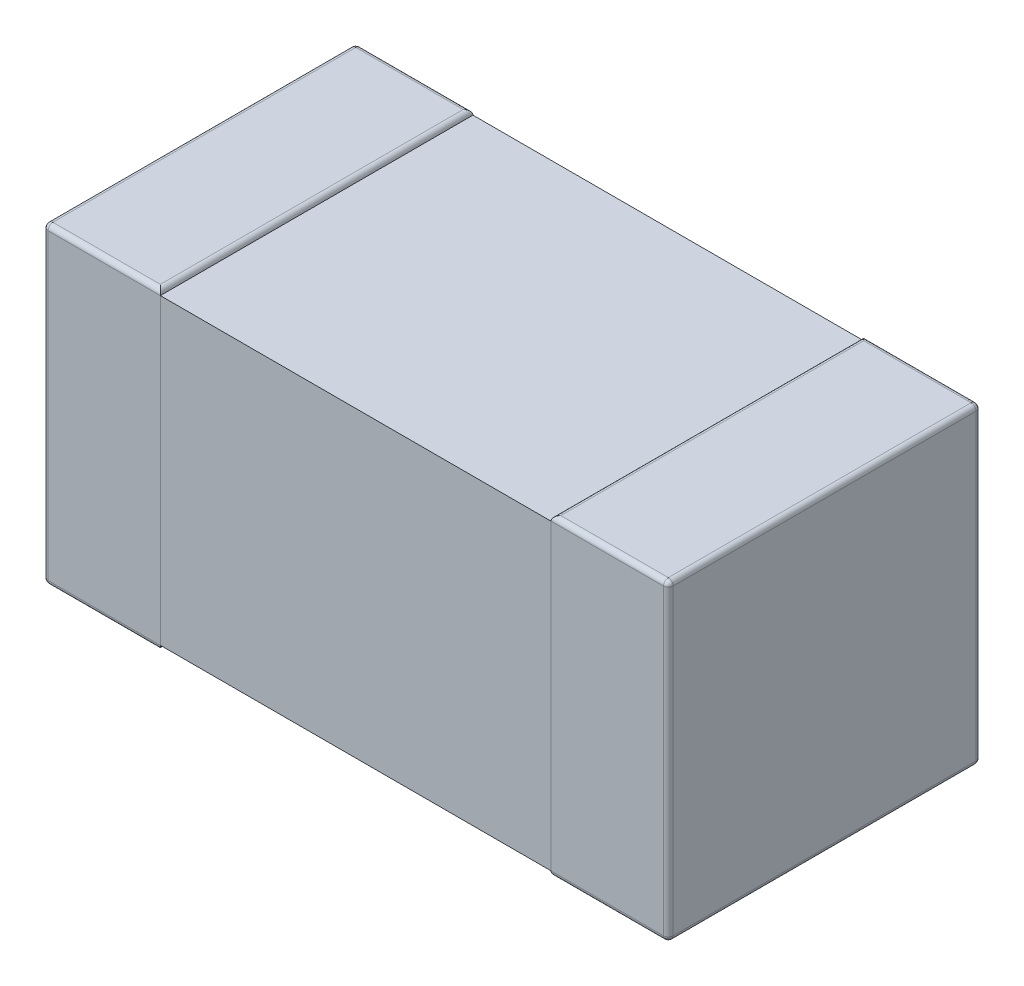
ISO-10303-21;
HEADER;
FILE_DESCRIPTION(('STEP AP214'),'2;1');
FILE_NAME('part.step','',(''),(''),'','','');
FILE_SCHEMA(('AUTOMOTIVE_DESIGN { 1 0 10303 214 1 1 1 1 }'));
ENDSEC;
DATA;
#1=APPLICATION_CONTEXT('core data for automotive mechanical design processes');
#2=APPLICATION_PROTOCOL_DEFINITION('international standard','automotive_design',2000,#1);
#3=PRODUCT_CONTEXT('',#1,'mechanical');
#4=PRODUCT('Part','Part','',(#3));
#5=PRODUCT_RELATED_PRODUCT_CATEGORY('part','',(#4));
#6=PRODUCT_DEFINITION_FORMATION('','',#4);
#7=PRODUCT_DEFINITION_CONTEXT('part definition',#1,'design');
#8=PRODUCT_DEFINITION('design','',#6,#7);
#9=PRODUCT_DEFINITION_SHAPE('','',#8);
#10=(LENGTH_UNIT() NAMED_UNIT(*) SI_UNIT(.MILLI.,.METRE.));
#11=(NAMED_UNIT(*) PLANE_ANGLE_UNIT() SI_UNIT($,.RADIAN.));
#12=(NAMED_UNIT(*) SI_UNIT($,.STERADIAN.) SOLID_ANGLE_UNIT());
#13=UNCERTAINTY_MEASURE_WITH_UNIT(LENGTH_MEASURE(1.E-05),#10,'distance_accuracy_value','');
#14=(GEOMETRIC_REPRESENTATION_CONTEXT(3) GLOBAL_UNCERTAINTY_ASSIGNED_CONTEXT((#13)) GLOBAL_UNIT_ASSIGNED_CONTEXT((#10,
#11,#12)) REPRESENTATION_CONTEXT('',''));
#15=CARTESIAN_POINT('',(0.,0.,0.));
#16=DIRECTION('',(0.,0.,1.));
#17=DIRECTION('',(1.,0.,0.));
#18=AXIS2_PLACEMENT_3D('',#15,#16,#17);
#19=CARTESIAN_POINT('',(-0.8,0.8125,-0.4));
#20=DIRECTION('',(0.,0.,1.));
#21=DIRECTION('',(1.,0.,0.));
#22=AXIS2_PLACEMENT_3D('',#19,#20,#21);
#23=PLANE('',#22);
#24=DIRECTION('',(0.,1.,0.));
#25=VECTOR('',#24,1.);
#26=CARTESIAN_POINT('',(-0.5,0.8125,-0.4));
#27=LINE('',#26,#25);
#28=CARTESIAN_POINT('',(-0.5,0.025,-0.4));
#29=VERTEX_POINT('',#28);
#30=CARTESIAN_POINT('',(-0.5,0.8,-0.4));
#31=VERTEX_POINT('',#30);
#32=EDGE_CURVE('E299',#29,#31,#27,.T.);
#33=ORIENTED_EDGE('',*,*,#32,.F.);
#34=DIRECTION('',(-1.,0.,0.));
#35=VECTOR('',#34,1.);
#36=CARTESIAN_POINT('',(-0.8,0.025,-0.4));
#37=LINE('',#36,#35);
#38=CARTESIAN_POINT('',(-0.7875,0.025,-0.4));
#39=VERTEX_POINT('',#38);
#40=EDGE_CURVE('E11',#29,#39,#37,.T.);
#41=ORIENTED_EDGE('',*,*,#40,.T.);
#42=DIRECTION('',(0.,1.,0.));
#43=VECTOR('',#42,1.);
#44=CARTESIAN_POINT('',(-0.7875,0.8125,-0.4));
#45=LINE('',#44,#43);
#46=CARTESIAN_POINT('',(-0.7875,0.8,-0.4));
#47=VERTEX_POINT('',#46);
#48=EDGE_CURVE('E27',#39,#47,#45,.T.);
#49=ORIENTED_EDGE('',*,*,#48,.T.);
#50=DIRECTION('',(1.,0.,0.));
#51=VECTOR('',#50,1.);
#52=CARTESIAN_POINT('',(-0.8,0.8,-0.4));
#53=LINE('',#52,#51);
#54=EDGE_CURVE('E381',#47,#31,#53,.T.);
#55=ORIENTED_EDGE('',*,*,#54,.T.);
#56=EDGE_LOOP('',(#33,#41,#49,#55));
#57=FACE_BOUND('',#56,.T.);
#58=ADVANCED_FACE('F16',(#57),#23,.F.);
#59=CARTESIAN_POINT('',(-0.8,0.8125,-0.4));
#60=DIRECTION('',(0.,0.,1.));
#61=DIRECTION('',(1.,0.,0.));
#62=AXIS2_PLACEMENT_3D('',#59,#60,#61);
#63=PLANE('',#62);
#64=DIRECTION('',(0.,-1.,0.));
#65=VECTOR('',#64,1.);
#66=CARTESIAN_POINT('',(0.5,0.8125,-0.4));
#67=LINE('',#66,#65);
#68=CARTESIAN_POINT('',(0.5,0.8,-0.4));
#69=VERTEX_POINT('',#68);
#70=CARTESIAN_POINT('',(0.5,0.025,-0.4));
#71=VERTEX_POINT('',#70);
#72=EDGE_CURVE('E300',#69,#71,#67,.T.);
#73=ORIENTED_EDGE('',*,*,#72,.F.);
#74=DIRECTION('',(1.,0.,0.));
#75=VECTOR('',#74,1.);
#76=CARTESIAN_POINT('',(-0.8,0.8,-0.4));
#77=LINE('',#76,#75);
#78=CARTESIAN_POINT('',(0.7875,0.8,-0.4));
#79=VERTEX_POINT('',#78);
#80=EDGE_CURVE('E352',#69,#79,#77,.T.);
#81=ORIENTED_EDGE('',*,*,#80,.T.);
#82=DIRECTION('',(0.,-1.,0.));
#83=VECTOR('',#82,1.);
#84=CARTESIAN_POINT('',(0.7875,0.8125,-0.4));
#85=LINE('',#84,#83);
#86=CARTESIAN_POINT('',(0.7875,0.025,-0.4));
#87=VERTEX_POINT('',#86);
#88=EDGE_CURVE('E345',#79,#87,#85,.T.);
#89=ORIENTED_EDGE('',*,*,#88,.T.);
#90=DIRECTION('',(-1.,0.,0.));
#91=VECTOR('',#90,1.);
#92=CARTESIAN_POINT('',(0.5,0.025,-0.4));
#93=LINE('',#92,#91);
#94=EDGE_CURVE('E353',#87,#71,#93,.T.);
#95=ORIENTED_EDGE('',*,*,#94,.T.);
#96=EDGE_LOOP('',(#73,#81,#89,#95));
#97=FACE_BOUND('',#96,.T.);
#98=ADVANCED_FACE('F906',(#97),#63,.F.);
#99=CARTESIAN_POINT('',(-0.8,0.8125,0.4));
#100=DIRECTION('',(0.,0.,-1.));
#101=DIRECTION('',(0.,-1.,0.));
#102=AXIS2_PLACEMENT_3D('',#99,#100,#101);
#103=PLANE('',#102);
#104=DIRECTION('',(0.,-1.,0.));
#105=VECTOR('',#104,1.);
#106=CARTESIAN_POINT('',(-0.7875,0.8125,0.4));
#107=LINE('',#106,#105);
#108=CARTESIAN_POINT('',(-0.7875,0.8,0.4));
#109=VERTEX_POINT('',#108);
#110=CARTESIAN_POINT('',(-0.7875,0.025,0.4));
#111=VERTEX_POINT('',#110);
#112=EDGE_CURVE('E447',#109,#111,#107,.T.);
#113=ORIENTED_EDGE('',*,*,#112,.T.);
#114=DIRECTION('',(1.,0.,0.));
#115=VECTOR('',#114,1.);
#116=CARTESIAN_POINT('',(-0.5,0.025,0.4));
#117=LINE('',#116,#115);
#118=CARTESIAN_POINT('',(-0.5,0.025,0.4));
#119=VERTEX_POINT('',#118);
#120=EDGE_CURVE('E377',#111,#119,#117,.T.);
#121=ORIENTED_EDGE('',*,*,#120,.T.);
#122=DIRECTION('',(0.,-1.,0.));
#123=VECTOR('',#122,1.);
#124=CARTESIAN_POINT('',(-0.5,0.8125,0.4));
#125=LINE('',#124,#123);
#126=CARTESIAN_POINT('',(-0.5,0.8,0.4));
#127=VERTEX_POINT('',#126);
#128=EDGE_CURVE('E246',#127,#119,#125,.T.);
#129=ORIENTED_EDGE('',*,*,#128,.F.);
#130=DIRECTION('',(-1.,0.,0.));
#131=VECTOR('',#130,1.);
#132=CARTESIAN_POINT('',(-0.8,0.8,0.4));
#133=LINE('',#132,#131);
#134=EDGE_CURVE('E373',#127,#109,#133,.T.);
#135=ORIENTED_EDGE('',*,*,#134,.T.);
#136=EDGE_LOOP('',(#113,#121,#129,#135));
#137=FACE_BOUND('',#136,.T.);
#138=ADVANCED_FACE('F1104',(#137),#103,.F.);
#139=CARTESIAN_POINT('',(-0.8,0.8125,0.4));
#140=DIRECTION('',(0.,0.,-1.));
#141=DIRECTION('',(0.,-1.,0.));
#142=AXIS2_PLACEMENT_3D('',#139,#140,#141);
#143=PLANE('',#142);
#144=DIRECTION('',(0.,1.,0.));
#145=VECTOR('',#144,1.);
#146=CARTESIAN_POINT('',(0.7875,0.8125,0.4));
#147=LINE('',#146,#145);
#148=CARTESIAN_POINT('',(0.7875,0.025,0.4));
#149=VERTEX_POINT('',#148);
#150=CARTESIAN_POINT('',(0.7875,0.8,0.4));
#151=VERTEX_POINT('',#150);
#152=EDGE_CURVE('E305',#149,#151,#147,.T.);
#153=ORIENTED_EDGE('',*,*,#152,.T.);
#154=DIRECTION('',(-1.,0.,0.));
#155=VECTOR('',#154,1.);
#156=CARTESIAN_POINT('',(-0.8,0.8,0.4));
#157=LINE('',#156,#155);
#158=CARTESIAN_POINT('',(0.5,0.8,0.4));
#159=VERTEX_POINT('',#158);
#160=EDGE_CURVE('E301',#151,#159,#157,.T.);
#161=ORIENTED_EDGE('',*,*,#160,.T.);
#162=DIRECTION('',(0.,1.,0.));
#163=VECTOR('',#162,1.);
#164=CARTESIAN_POINT('',(0.5,0.8125,0.4));
#165=LINE('',#164,#163);
#166=CARTESIAN_POINT('',(0.5,0.025,0.4));
#167=VERTEX_POINT('',#166);
#168=EDGE_CURVE('E253',#167,#159,#165,.T.);
#169=ORIENTED_EDGE('',*,*,#168,.F.);
#170=DIRECTION('',(1.,0.,0.));
#171=VECTOR('',#170,1.);
#172=CARTESIAN_POINT('',(0.8,0.025,0.4));
#173=LINE('',#172,#171);
#174=EDGE_CURVE('E306',#167,#149,#173,.T.);
#175=ORIENTED_EDGE('',*,*,#174,.T.);
#176=EDGE_LOOP('',(#153,#161,#169,#175));
#177=FACE_BOUND('',#176,.T.);
#178=ADVANCED_FACE('F931',(#177),#143,.F.);
#179=CARTESIAN_POINT('',(0.,0.8125,0.));
#180=DIRECTION('',(0.,-1.,0.));
#181=DIRECTION('',(0.,0.,-1.));
#182=AXIS2_PLACEMENT_3D('',#179,#180,#181);
#183=PLANE('',#182);
#184=DIRECTION('',(-1.,0.,0.));
#185=VECTOR('',#184,1.);
#186=CARTESIAN_POINT('',(0.,0.8125,-0.3875));
#187=LINE('',#186,#185);
#188=CARTESIAN_POINT('',(-0.5125,0.8125,-0.3875));
#189=VERTEX_POINT('',#188);
#190=CARTESIAN_POINT('',(-0.7875,0.8125,-0.3875));
#191=VERTEX_POINT('',#190);
#192=EDGE_CURVE('E259',#189,#191,#187,.T.);
#193=ORIENTED_EDGE('',*,*,#192,.T.);
#194=DIRECTION('',(0.,0.,1.));
#195=VECTOR('',#194,1.);
#196=CARTESIAN_POINT('',(-0.7875,0.8125,0.));
#197=LINE('',#196,#195);
#198=CARTESIAN_POINT('',(-0.7875,0.8125,0.3875));
#199=VERTEX_POINT('',#198);
#200=EDGE_CURVE('E255',#191,#199,#197,.T.);
#201=ORIENTED_EDGE('',*,*,#200,.T.);
#202=DIRECTION('',(1.,0.,0.));
#203=VECTOR('',#202,1.);
#204=CARTESIAN_POINT('',(0.,0.8125,0.3875));
#205=LINE('',#204,#203);
#206=CARTESIAN_POINT('',(-0.5125,0.8125,0.3875));
#207=VERTEX_POINT('',#206);
#208=EDGE_CURVE('E260',#199,#207,#205,.T.);
#209=ORIENTED_EDGE('',*,*,#208,.T.);
#210=DIRECTION('',(0.,0.,-1.));
#211=VECTOR('',#210,1.);
#212=CARTESIAN_POINT('',(-0.5125,0.8125,0.));
#213=LINE('',#212,#211);
#214=EDGE_CURVE('E401',#207,#189,#213,.T.);
#215=ORIENTED_EDGE('',*,*,#214,.T.);
#216=EDGE_LOOP('',(#193,#201,#209,#215));
#217=FACE_BOUND('',#216,.T.);
#218=ADVANCED_FACE('F927',(#217),#183,.F.);
#219=CARTESIAN_POINT('',(0.,0.0125,0.));
#220=DIRECTION('',(0.,-1.,0.));
#221=DIRECTION('',(0.,0.,-1.));
#222=AXIS2_PLACEMENT_3D('',#219,#220,#221);
#223=PLANE('',#222);
#224=DIRECTION('',(1.,0.,0.));
#225=VECTOR('',#224,1.);
#226=CARTESIAN_POINT('',(-0.5,0.0125,-0.3875));
#227=LINE('',#226,#225);
#228=CARTESIAN_POINT('',(-0.7875,0.0125,-0.3875));
#229=VERTEX_POINT('',#228);
#230=CARTESIAN_POINT('',(-0.5125,0.0125,-0.3875));
#231=VERTEX_POINT('',#230);
#232=EDGE_CURVE('E221',#229,#231,#227,.T.);
#233=ORIENTED_EDGE('',*,*,#232,.T.);
#234=DIRECTION('',(0.,0.,1.));
#235=VECTOR('',#234,1.);
#236=CARTESIAN_POINT('',(-0.5125,0.0125,0.4));
#237=LINE('',#236,#235);
#238=CARTESIAN_POINT('',(-0.5125,0.0125,0.3875));
#239=VERTEX_POINT('',#238);
#240=EDGE_CURVE('E215',#231,#239,#237,.T.);
#241=ORIENTED_EDGE('',*,*,#240,.T.);
#242=DIRECTION('',(-1.,0.,0.));
#243=VECTOR('',#242,1.);
#244=CARTESIAN_POINT('',(-0.8,0.0125,0.3875));
#245=LINE('',#244,#243);
#246=CARTESIAN_POINT('',(-0.7875,0.0125,0.3875));
#247=VERTEX_POINT('',#246);
#248=EDGE_CURVE('E204',#239,#247,#245,.T.);
#249=ORIENTED_EDGE('',*,*,#248,.T.);
#250=DIRECTION('',(0.,0.,-1.));
#251=VECTOR('',#250,1.);
#252=CARTESIAN_POINT('',(-0.7875,0.0125,-0.4));
#253=LINE('',#252,#251);
#254=EDGE_CURVE('E216',#247,#229,#253,.T.);
#255=ORIENTED_EDGE('',*,*,#254,.T.);
#256=EDGE_LOOP('',(#233,#241,#249,#255));
#257=FACE_BOUND('',#256,.T.);
#258=ADVANCED_FACE('F219',(#257),#223,.T.);
#259=CARTESIAN_POINT('',(0.8,0.8125,0.4));
#260=DIRECTION('',(-1.,0.,0.));
#261=DIRECTION('',(0.,0.,1.));
#262=AXIS2_PLACEMENT_3D('',#259,#260,#261);
#263=PLANE('',#262);
#264=DIRECTION('',(0.,0.,1.));
#265=VECTOR('',#264,1.);
#266=CARTESIAN_POINT('',(0.8,0.8,0.4));
#267=LINE('',#266,#265);
#268=CARTESIAN_POINT('',(0.8,0.8,-0.3875));
#269=VERTEX_POINT('',#268);
#270=CARTESIAN_POINT('',(0.8,0.8,0.3875));
#271=VERTEX_POINT('',#270);
#272=EDGE_CURVE('E410',#269,#271,#267,.T.);
#273=ORIENTED_EDGE('',*,*,#272,.T.);
#274=DIRECTION('',(0.,-1.,0.));
#275=VECTOR('',#274,1.);
#276=CARTESIAN_POINT('',(0.8,0.8125,0.3875));
#277=LINE('',#276,#275);
#278=CARTESIAN_POINT('',(0.8,0.025,0.3875));
#279=VERTEX_POINT('',#278);
#280=EDGE_CURVE('E414',#271,#279,#277,.T.);
#281=ORIENTED_EDGE('',*,*,#280,.T.);
#282=DIRECTION('',(0.,0.,-1.));
#283=VECTOR('',#282,1.);
#284=CARTESIAN_POINT('',(0.8,0.025,-0.4));
#285=LINE('',#284,#283);
#286=CARTESIAN_POINT('',(0.8,0.025,-0.3875));
#287=VERTEX_POINT('',#286);
#288=EDGE_CURVE('E386',#279,#287,#285,.T.);
#289=ORIENTED_EDGE('',*,*,#288,.T.);
#290=DIRECTION('',(0.,1.,0.));
#291=VECTOR('',#290,1.);
#292=CARTESIAN_POINT('',(0.8,0.8125,-0.3875));
#293=LINE('',#292,#291);
#294=EDGE_CURVE('E382',#287,#269,#293,.T.);
#295=ORIENTED_EDGE('',*,*,#294,.T.);
#296=EDGE_LOOP('',(#273,#281,#289,#295));
#297=FACE_BOUND('',#296,.T.);
#298=ADVANCED_FACE('F1152',(#297),#263,.F.);
#299=CARTESIAN_POINT('',(-0.8,0.8125,-0.4));
#300=DIRECTION('',(0.,0.,1.));
#301=DIRECTION('',(1.,0.,0.));
#302=AXIS2_PLACEMENT_3D('',#299,#300,#301);
#303=PLANE('',#302);
#304=DIRECTION('',(-1.,0.,0.));
#305=VECTOR('',#304,1.);
#306=CARTESIAN_POINT('',(-0.5,0.025,-0.4));
#307=LINE('',#306,#305);
#308=EDGE_CURVE('E387',#71,#29,#307,.T.);
#309=ORIENTED_EDGE('',*,*,#308,.T.);
#310=ORIENTED_EDGE('',*,*,#32,.T.);
#311=DIRECTION('',(1.,0.,0.));
#312=VECTOR('',#311,1.);
#313=CARTESIAN_POINT('',(-0.5,0.8,-0.4));
#314=LINE('',#313,#312);
#315=EDGE_CURVE('E295',#31,#69,#314,.T.);
#316=ORIENTED_EDGE('',*,*,#315,.T.);
#317=ORIENTED_EDGE('',*,*,#72,.T.);
#318=EDGE_LOOP('',(#309,#310,#316,#317));
#319=FACE_BOUND('',#318,.T.);
#320=ADVANCED_FACE('F1072',(#319),#303,.F.);
#321=CARTESIAN_POINT('',(-0.8,0.8125,0.4));
#322=DIRECTION('',(1.,0.,0.));
#323=DIRECTION('',(0.,1.,0.));
#324=AXIS2_PLACEMENT_3D('',#321,#322,#323);
#325=PLANE('',#324);
#326=DIRECTION('',(0.,-1.,0.));
#327=VECTOR('',#326,1.);
#328=CARTESIAN_POINT('',(-0.8,0.8125,-0.3875));
#329=LINE('',#328,#327);
#330=CARTESIAN_POINT('',(-0.8,0.8,-0.3875));
#331=VERTEX_POINT('',#330);
#332=CARTESIAN_POINT('',(-0.8,0.025,-0.3875));
#333=VERTEX_POINT('',#332);
#334=EDGE_CURVE('E330',#331,#333,#329,.T.);
#335=ORIENTED_EDGE('',*,*,#334,.T.);
#336=DIRECTION('',(0.,0.,1.));
#337=VECTOR('',#336,1.);
#338=CARTESIAN_POINT('',(-0.8,0.025,0.4));
#339=LINE('',#338,#337);
#340=CARTESIAN_POINT('',(-0.8,0.025,0.3875));
#341=VERTEX_POINT('',#340);
#342=EDGE_CURVE('E324',#333,#341,#339,.T.);
#343=ORIENTED_EDGE('',*,*,#342,.T.);
#344=DIRECTION('',(0.,1.,0.));
#345=VECTOR('',#344,1.);
#346=CARTESIAN_POINT('',(-0.8,0.8125,0.3875));
#347=LINE('',#346,#345);
#348=CARTESIAN_POINT('',(-0.8,0.8,0.3875));
#349=VERTEX_POINT('',#348);
#350=EDGE_CURVE('E331',#341,#349,#347,.T.);
#351=ORIENTED_EDGE('',*,*,#350,.T.);
#352=DIRECTION('',(0.,0.,-1.));
#353=VECTOR('',#352,1.);
#354=CARTESIAN_POINT('',(-0.8,0.8,0.4));
#355=LINE('',#354,#353);
#356=EDGE_CURVE('E252',#349,#331,#355,.T.);
#357=ORIENTED_EDGE('',*,*,#356,.T.);
#358=EDGE_LOOP('',(#335,#343,#351,#357));
#359=FACE_BOUND('',#358,.T.);
#360=ADVANCED_FACE('F1068',(#359),#325,.F.);
#361=CARTESIAN_POINT('',(-0.8,0.8125,0.4));
#362=DIRECTION('',(0.,0.,-1.));
#363=DIRECTION('',(0.,-1.,0.));
#364=AXIS2_PLACEMENT_3D('',#361,#362,#363);
#365=PLANE('',#364);
#366=DIRECTION('',(1.,0.,0.));
#367=VECTOR('',#366,1.);
#368=CARTESIAN_POINT('',(-0.5,0.8,0.4));
#369=LINE('',#368,#367);
#370=EDGE_CURVE('E271',#127,#159,#369,.T.);
#371=ORIENTED_EDGE('',*,*,#370,.F.);
#372=ORIENTED_EDGE('',*,*,#128,.T.);
#373=DIRECTION('',(-1.,0.,0.));
#374=VECTOR('',#373,1.);
#375=CARTESIAN_POINT('',(-0.5,0.025,0.4));
#376=LINE('',#375,#374);
#377=EDGE_CURVE('E270',#167,#119,#376,.T.);
#378=ORIENTED_EDGE('',*,*,#377,.F.);
#379=ORIENTED_EDGE('',*,*,#168,.T.);
#380=EDGE_LOOP('',(#371,#372,#378,#379));
#381=FACE_BOUND('',#380,.T.);
#382=ADVANCED_FACE('F894',(#381),#365,.F.);
#383=CARTESIAN_POINT('',(0.,0.8125,0.));
#384=DIRECTION('',(0.,-1.,0.));
#385=DIRECTION('',(0.,0.,-1.));
#386=AXIS2_PLACEMENT_3D('',#383,#384,#385);
#387=PLANE('',#386);
#388=DIRECTION('',(0.,0.,1.));
#389=VECTOR('',#388,1.);
#390=CARTESIAN_POINT('',(0.5125,0.8125,0.));
#391=LINE('',#390,#389);
#392=CARTESIAN_POINT('',(0.5125,0.8125,-0.3875));
#393=VERTEX_POINT('',#392);
#394=CARTESIAN_POINT('',(0.5125,0.8125,0.3875));
#395=VERTEX_POINT('',#394);
#396=EDGE_CURVE('E20',#393,#395,#391,.T.);
#397=ORIENTED_EDGE('',*,*,#396,.T.);
#398=DIRECTION('',(1.,0.,0.));
#399=VECTOR('',#398,1.);
#400=CARTESIAN_POINT('',(0.,0.8125,0.3875));
#401=LINE('',#400,#399);
#402=CARTESIAN_POINT('',(0.7875,0.8125,0.3875));
#403=VERTEX_POINT('',#402);
#404=EDGE_CURVE('E177',#395,#403,#401,.T.);
#405=ORIENTED_EDGE('',*,*,#404,.T.);
#406=DIRECTION('',(0.,0.,-1.));
#407=VECTOR('',#406,1.);
#408=CARTESIAN_POINT('',(0.7875,0.8125,0.));
#409=LINE('',#408,#407);
#410=CARTESIAN_POINT('',(0.7875,0.8125,-0.3875));
#411=VERTEX_POINT('',#410);
#412=EDGE_CURVE('E286',#403,#411,#409,.T.);
#413=ORIENTED_EDGE('',*,*,#412,.T.);
#414=DIRECTION('',(-1.,0.,0.));
#415=VECTOR('',#414,1.);
#416=CARTESIAN_POINT('',(0.,0.8125,-0.3875));
#417=LINE('',#416,#415);
#418=EDGE_CURVE('E265',#411,#393,#417,.T.);
#419=ORIENTED_EDGE('',*,*,#418,.T.);
#420=EDGE_LOOP('',(#397,#405,#413,#419));
#421=FACE_BOUND('',#420,.T.);
#422=ADVANCED_FACE('F869',(#421),#387,.F.);
#423=CARTESIAN_POINT('',(0.,0.0125,0.));
#424=DIRECTION('',(0.,-1.,0.));
#425=DIRECTION('',(0.,0.,-1.));
#426=AXIS2_PLACEMENT_3D('',#423,#424,#425);
#427=PLANE('',#426);
#428=DIRECTION('',(0.,0.,1.));
#429=VECTOR('',#428,1.);
#430=CARTESIAN_POINT('',(0.7875,0.0125,0.4));
#431=LINE('',#430,#429);
#432=CARTESIAN_POINT('',(0.7875,0.0125,-0.3875));
#433=VERTEX_POINT('',#432);
#434=CARTESIAN_POINT('',(0.7875,0.0125,0.3875));
#435=VERTEX_POINT('',#434);
#436=EDGE_CURVE('E261',#433,#435,#431,.T.);
#437=ORIENTED_EDGE('',*,*,#436,.T.);
#438=DIRECTION('',(-1.,0.,0.));
#439=VECTOR('',#438,1.);
#440=CARTESIAN_POINT('',(0.5,0.0125,0.3875));
#441=LINE('',#440,#439);
#442=CARTESIAN_POINT('',(0.5125,0.0125,0.3875));
#443=VERTEX_POINT('',#442);
#444=EDGE_CURVE('E266',#435,#443,#441,.T.);
#445=ORIENTED_EDGE('',*,*,#444,.T.);
#446=DIRECTION('',(0.,0.,-1.));
#447=VECTOR('',#446,1.);
#448=CARTESIAN_POINT('',(0.5125,0.0125,-0.4));
#449=LINE('',#448,#447);
#450=CARTESIAN_POINT('',(0.5125,0.0125,-0.3875));
#451=VERTEX_POINT('',#450);
#452=EDGE_CURVE('E318',#443,#451,#449,.T.);
#453=ORIENTED_EDGE('',*,*,#452,.T.);
#454=DIRECTION('',(1.,0.,0.));
#455=VECTOR('',#454,1.);
#456=CARTESIAN_POINT('',(0.8,0.0125,-0.3875));
#457=LINE('',#456,#455);
#458=EDGE_CURVE('E394',#451,#433,#457,.T.);
#459=ORIENTED_EDGE('',*,*,#458,.T.);
#460=EDGE_LOOP('',(#437,#445,#453,#459));
#461=FACE_BOUND('',#460,.T.);
#462=ADVANCED_FACE('F864',(#461),#427,.T.);
#463=CARTESIAN_POINT('',(-0.5,0.025,-0.4));
#464=DIRECTION('',(0.,1.,0.));
#465=DIRECTION('',(1.,0.,0.));
#466=AXIS2_PLACEMENT_3D('',#463,#464,#465);
#467=PLANE('',#466);
#468=ORIENTED_EDGE('',*,*,#377,.T.);
#469=DIRECTION('',(0.,0.,1.));
#470=VECTOR('',#469,1.);
#471=CARTESIAN_POINT('',(-0.5,0.025,-0.4));
#472=LINE('',#471,#470);
#473=EDGE_CURVE('E42',#29,#119,#472,.T.);
#474=ORIENTED_EDGE('',*,*,#473,.F.);
#475=ORIENTED_EDGE('',*,*,#308,.F.);
#476=DIRECTION('',(0.,0.,1.));
#477=VECTOR('',#476,1.);
#478=CARTESIAN_POINT('',(0.5,0.025,-0.4));
#479=LINE('',#478,#477);
#480=EDGE_CURVE('E267',#71,#167,#479,.T.);
#481=ORIENTED_EDGE('',*,*,#480,.T.);
#482=EDGE_LOOP('',(#468,#474,#475,#481));
#483=FACE_BOUND('',#482,.T.);
#484=ADVANCED_FACE('F868',(#483),#467,.F.);
#485=CARTESIAN_POINT('',(-0.5,0.8,-0.4));
#486=DIRECTION('',(0.,-1.,0.));
#487=DIRECTION('',(0.,0.,-1.));
#488=AXIS2_PLACEMENT_3D('',#485,#486,#487);
#489=PLANE('',#488);
#490=ORIENTED_EDGE('',*,*,#370,.T.);
#491=DIRECTION('',(0.,0.,1.));
#492=VECTOR('',#491,1.);
#493=CARTESIAN_POINT('',(0.5,0.8,-0.4));
#494=LINE('',#493,#492);
#495=EDGE_CURVE('E368',#69,#159,#494,.T.);
#496=ORIENTED_EDGE('',*,*,#495,.F.);
#497=ORIENTED_EDGE('',*,*,#315,.F.);
#498=DIRECTION('',(0.,0.,1.));
#499=VECTOR('',#498,1.);
#500=CARTESIAN_POINT('',(-0.5,0.8,-0.4));
#501=LINE('',#500,#499);
#502=EDGE_CURVE('E372',#31,#127,#501,.T.);
#503=ORIENTED_EDGE('',*,*,#502,.T.);
#504=EDGE_LOOP('',(#490,#496,#497,#503));
#505=FACE_BOUND('',#504,.T.);
#506=ADVANCED_FACE('F1028',(#505),#489,.F.);
#507=CARTESIAN_POINT('',(-0.8,0.025,-0.3875));
#508=DIRECTION('',(1.,0.,0.));
#509=DIRECTION('',(0.,0.,-1.));
#510=AXIS2_PLACEMENT_3D('',#507,#508,#509);
#511=CYLINDRICAL_SURFACE('',#510,0.0125);
#512=CARTESIAN_POINT('',(0.7875,0.025,-0.3875));
#513=DIRECTION('',(1.,0.,0.));
#514=DIRECTION('',(0.,0.,-1.));
#515=AXIS2_PLACEMENT_3D('',#512,#513,#514);
#516=CIRCLE('',#515,0.0125);
#517=EDGE_CURVE('E465',#433,#87,#516,.T.);
#518=ORIENTED_EDGE('',*,*,#517,.F.);
#519=ORIENTED_EDGE('',*,*,#458,.F.);
#520=CARTESIAN_POINT('',(0.5,0.025,-0.4));
#521=CARTESIAN_POINT('',(0.499999999999999,0.0176776695296636,-0.4));
#522=CARTESIAN_POINT('',(0.505177669529663,0.0124999999999999,-0.394822330470336));
#523=CARTESIAN_POINT('',(0.5125,0.0125,-0.3875));
#524=(BOUNDED_CURVE() B_SPLINE_CURVE(3,(#520,#521,#522,#523),.UNSPECIFIED.,.F.,
.F.) B_SPLINE_CURVE_WITH_KNOTS((4,4),(0.,1.5707963267949),
.UNSPECIFIED.) CURVE() GEOMETRIC_REPRESENTATION_ITEM() RATIONAL_B_SPLINE_CURVE((1.,
0.804737854124364,0.804737854124364,1.)) REPRESENTATION_ITEM(''));
#525=EDGE_CURVE('E430',#71,#451,#524,.T.);
#526=ORIENTED_EDGE('',*,*,#525,.F.);
#527=ORIENTED_EDGE('',*,*,#94,.F.);
#528=EDGE_LOOP('',(#518,#519,#526,#527));
#529=FACE_BOUND('',#528,.T.);
#530=ADVANCED_FACE('F1085',(#529),#511,.T.);
#531=CARTESIAN_POINT('',(0.7875,0.025,-0.3875));
#532=DIRECTION('',(0.,1.,0.));
#533=DIRECTION('',(1.,0.,0.));
#534=AXIS2_PLACEMENT_3D('',#531,#532,#533);
#535=SPHERICAL_SURFACE('',#534,0.0125);
#536=CARTESIAN_POINT('',(0.7875,0.025,-0.3875));
#537=DIRECTION('',(0.,0.,1.));
#538=DIRECTION('',(-1.,0.,0.));
#539=AXIS2_PLACEMENT_3D('',#536,#537,#538);
#540=CIRCLE('',#539,0.0125);
#541=EDGE_CURVE('E431',#433,#287,#540,.T.);
#542=ORIENTED_EDGE('',*,*,#541,.F.);
#543=ORIENTED_EDGE('',*,*,#517,.T.);
#544=CARTESIAN_POINT('',(0.7875,0.025,-0.3875));
#545=DIRECTION('',(0.,1.,0.));
#546=DIRECTION('',(0.,0.,-1.));
#547=AXIS2_PLACEMENT_3D('',#544,#545,#546);
#548=CIRCLE('',#547,0.0125);
#549=EDGE_CURVE('E426',#287,#87,#548,.T.);
#550=ORIENTED_EDGE('',*,*,#549,.F.);
#551=EDGE_LOOP('',(#542,#543,#550));
#552=FACE_BOUND('',#551,.T.);
#553=ADVANCED_FACE('F1081',(#552),#535,.T.);
#554=CARTESIAN_POINT('',(0.5125,0.025,-0.4));
#555=DIRECTION('',(0.,0.,-1.));
#556=DIRECTION('',(-1.,0.,0.));
#557=AXIS2_PLACEMENT_3D('',#554,#555,#556);
#558=CYLINDRICAL_SURFACE('',#557,0.0125);
#559=ORIENTED_EDGE('',*,*,#525,.T.);
#560=ORIENTED_EDGE('',*,*,#452,.F.);
#561=CARTESIAN_POINT('',(0.5,0.025,0.4));
#562=CARTESIAN_POINT('',(0.5,0.0176776695296638,0.4));
#563=CARTESIAN_POINT('',(0.505177669529663,0.0125,0.394822330470337));
#564=CARTESIAN_POINT('',(0.5125,0.0125,0.3875));
#565=(BOUNDED_CURVE() B_SPLINE_CURVE(3,(#561,#562,#563,#564),.UNSPECIFIED.,.F.,
.F.) B_SPLINE_CURVE_WITH_KNOTS((4,4),(3.14159265358978,4.71238898038469),
.UNSPECIFIED.) CURVE() GEOMETRIC_REPRESENTATION_ITEM() RATIONAL_B_SPLINE_CURVE((1.,
0.804737854124361,0.804737854124361,1.)) REPRESENTATION_ITEM(''));
#566=EDGE_CURVE('E425',#167,#443,#565,.T.);
#567=ORIENTED_EDGE('',*,*,#566,.F.);
#568=ORIENTED_EDGE('',*,*,#480,.F.);
#569=EDGE_LOOP('',(#559,#560,#567,#568));
#570=FACE_BOUND('',#569,.T.);
#571=ADVANCED_FACE('F944',(#570),#558,.T.);
#572=CARTESIAN_POINT('',(0.7875,0.8125,-0.3875));
#573=DIRECTION('',(0.,-1.,0.));
#574=DIRECTION('',(0.,0.,-1.));
#575=AXIS2_PLACEMENT_3D('',#572,#573,#574);
#576=CYLINDRICAL_SURFACE('',#575,0.0125);
#577=ORIENTED_EDGE('',*,*,#549,.T.);
#578=ORIENTED_EDGE('',*,*,#88,.F.);
#579=CARTESIAN_POINT('',(0.7875,0.8,-0.3875));
#580=DIRECTION('',(0.,1.,0.));
#581=DIRECTION('',(0.,0.,1.));
#582=AXIS2_PLACEMENT_3D('',#579,#580,#581);
#583=CIRCLE('',#582,0.0125);
#584=EDGE_CURVE('E364',#269,#79,#583,.T.);
#585=ORIENTED_EDGE('',*,*,#584,.F.);
#586=ORIENTED_EDGE('',*,*,#294,.F.);
#587=EDGE_LOOP('',(#577,#578,#585,#586));
#588=FACE_BOUND('',#587,.T.);
#589=ADVANCED_FACE('F940',(#588),#576,.T.);
#590=CARTESIAN_POINT('',(0.7875,0.025,0.4));
#591=DIRECTION('',(0.,0.,1.));
#592=DIRECTION('',(1.,0.,0.));
#593=AXIS2_PLACEMENT_3D('',#590,#591,#592);
#594=CYLINDRICAL_SURFACE('',#593,0.0125);
#595=ORIENTED_EDGE('',*,*,#541,.T.);
#596=ORIENTED_EDGE('',*,*,#288,.F.);
#597=CARTESIAN_POINT('',(0.7875,0.025,0.3875));
#598=DIRECTION('',(0.,0.,1.));
#599=DIRECTION('',(1.,0.,0.));
#600=AXIS2_PLACEMENT_3D('',#597,#598,#599);
#601=CIRCLE('',#600,0.0125);
#602=EDGE_CURVE('E337',#435,#279,#601,.T.);
#603=ORIENTED_EDGE('',*,*,#602,.F.);
#604=ORIENTED_EDGE('',*,*,#436,.F.);
#605=EDGE_LOOP('',(#595,#596,#603,#604));
#606=FACE_BOUND('',#605,.T.);
#607=ADVANCED_FACE('F18',(#606),#594,.T.);
#608=CARTESIAN_POINT('',(-0.8,0.025,0.3875));
#609=DIRECTION('',(-1.,0.,0.));
#610=DIRECTION('',(0.,0.,1.));
#611=AXIS2_PLACEMENT_3D('',#608,#609,#610);
#612=CYLINDRICAL_SURFACE('',#611,0.0125);
#613=ORIENTED_EDGE('',*,*,#566,.T.);
#614=ORIENTED_EDGE('',*,*,#444,.F.);
#615=CARTESIAN_POINT('',(0.7875,0.025,0.3875));
#616=DIRECTION('',(1.,0.,0.));
#617=DIRECTION('',(0.,0.,-1.));
#618=AXIS2_PLACEMENT_3D('',#615,#616,#617);
#619=CIRCLE('',#618,0.0125);
#620=EDGE_CURVE('E360',#149,#435,#619,.T.);
#621=ORIENTED_EDGE('',*,*,#620,.F.);
#622=ORIENTED_EDGE('',*,*,#174,.F.);
#623=EDGE_LOOP('',(#613,#614,#621,#622));
#624=FACE_BOUND('',#623,.T.);
#625=ADVANCED_FACE('F878',(#624),#612,.T.);
#626=CARTESIAN_POINT('',(0.7875,0.8,-0.3875));
#627=DIRECTION('',(0.,1.,0.));
#628=DIRECTION('',(1.,0.,0.));
#629=AXIS2_PLACEMENT_3D('',#626,#627,#628);
#630=SPHERICAL_SURFACE('',#629,0.0125);
#631=CARTESIAN_POINT('',(0.7875,0.8,-0.3875));
#632=DIRECTION('',(0.,0.,1.));
#633=DIRECTION('',(-1.,0.,0.));
#634=AXIS2_PLACEMENT_3D('',#631,#632,#633);
#635=CIRCLE('',#634,0.0125);
#636=EDGE_CURVE('E338',#269,#411,#635,.T.);
#637=ORIENTED_EDGE('',*,*,#636,.F.);
#638=ORIENTED_EDGE('',*,*,#584,.T.);
#639=CARTESIAN_POINT('',(0.7875,0.8,-0.3875));
#640=DIRECTION('',(-1.,0.,0.));
#641=DIRECTION('',(0.,1.,0.));
#642=AXIS2_PLACEMENT_3D('',#639,#640,#641);
#643=CIRCLE('',#642,0.0125);
#644=EDGE_CURVE('E333',#411,#79,#643,.T.);
#645=ORIENTED_EDGE('',*,*,#644,.F.);
#646=EDGE_LOOP('',(#637,#638,#645));
#647=FACE_BOUND('',#646,.T.);
#648=ADVANCED_FACE('F882',(#647),#630,.T.);
#649=CARTESIAN_POINT('',(0.7875,0.025,0.3875));
#650=DIRECTION('',(0.,1.,0.));
#651=DIRECTION('',(1.,0.,0.));
#652=AXIS2_PLACEMENT_3D('',#649,#650,#651);
#653=SPHERICAL_SURFACE('',#652,0.0125);
#654=ORIENTED_EDGE('',*,*,#620,.T.);
#655=ORIENTED_EDGE('',*,*,#602,.T.);
#656=CARTESIAN_POINT('',(0.7875,0.025,0.3875));
#657=DIRECTION('',(0.,1.,0.));
#658=DIRECTION('',(0.,0.,-1.));
#659=AXIS2_PLACEMENT_3D('',#656,#657,#658);
#660=CIRCLE('',#659,0.0125);
#661=EDGE_CURVE('E470',#149,#279,#660,.T.);
#662=ORIENTED_EDGE('',*,*,#661,.F.);
#663=EDGE_LOOP('',(#654,#655,#662));
#664=FACE_BOUND('',#663,.T.);
#665=ADVANCED_FACE('F915',(#664),#653,.T.);
#666=CARTESIAN_POINT('',(0.,0.8,-0.3875));
#667=DIRECTION('',(-1.,0.,0.));
#668=DIRECTION('',(0.,0.,1.));
#669=AXIS2_PLACEMENT_3D('',#666,#667,#668);
#670=CYLINDRICAL_SURFACE('',#669,0.0125);
#671=ORIENTED_EDGE('',*,*,#644,.T.);
#672=ORIENTED_EDGE('',*,*,#80,.F.);
#673=CARTESIAN_POINT('',(0.5125,0.8125,-0.3875));
#674=CARTESIAN_POINT('',(0.505177669529664,0.812500000000001,-0.394822330470337));
#675=CARTESIAN_POINT('',(0.5,0.807322330470337,-0.4));
#676=CARTESIAN_POINT('',(0.5,0.8,-0.4));
#677=(BOUNDED_CURVE() B_SPLINE_CURVE(3,(#673,#674,#675,#676),.UNSPECIFIED.,.F.,
.F.) B_SPLINE_CURVE_WITH_KNOTS((4,4),(4.71238898038469,6.28318530717959),
.UNSPECIFIED.) CURVE() GEOMETRIC_REPRESENTATION_ITEM() RATIONAL_B_SPLINE_CURVE((1.,
0.804737854124365,0.804737854124365,1.)) REPRESENTATION_ITEM(''));
#678=EDGE_CURVE('E473',#393,#69,#677,.T.);
#679=ORIENTED_EDGE('',*,*,#678,.F.);
#680=ORIENTED_EDGE('',*,*,#418,.F.);
#681=EDGE_LOOP('',(#671,#672,#679,#680));
#682=FACE_BOUND('',#681,.T.);
#683=ADVANCED_FACE('F828',(#682),#670,.T.);
#684=CARTESIAN_POINT('',(0.7875,0.8,0.));
#685=DIRECTION('',(0.,0.,-1.));
#686=DIRECTION('',(-1.,0.,0.));
#687=AXIS2_PLACEMENT_3D('',#684,#685,#686);
#688=CYLINDRICAL_SURFACE('',#687,0.0125);
#689=ORIENTED_EDGE('',*,*,#636,.T.);
#690=ORIENTED_EDGE('',*,*,#412,.F.);
#691=CARTESIAN_POINT('',(0.7875,0.8,0.3875));
#692=DIRECTION('',(0.,0.,1.));
#693=DIRECTION('',(1.,0.,0.));
#694=AXIS2_PLACEMENT_3D('',#691,#692,#693);
#695=CIRCLE('',#694,0.0125);
#696=EDGE_CURVE('E164',#271,#403,#695,.T.);
#697=ORIENTED_EDGE('',*,*,#696,.F.);
#698=ORIENTED_EDGE('',*,*,#272,.F.);
#699=EDGE_LOOP('',(#689,#690,#697,#698));
#700=FACE_BOUND('',#699,.T.);
#701=ADVANCED_FACE('F823',(#700),#688,.T.);
#702=CARTESIAN_POINT('',(0.7875,0.8125,0.3875));
#703=DIRECTION('',(0.,-1.,0.));
#704=DIRECTION('',(0.,0.,-1.));
#705=AXIS2_PLACEMENT_3D('',#702,#703,#704);
#706=CYLINDRICAL_SURFACE('',#705,0.0125);
#707=ORIENTED_EDGE('',*,*,#661,.T.);
#708=ORIENTED_EDGE('',*,*,#280,.F.);
#709=CARTESIAN_POINT('',(0.7875,0.8,0.3875));
#710=DIRECTION('',(0.,1.,0.));
#711=DIRECTION('',(0.,0.,1.));
#712=AXIS2_PLACEMENT_3D('',#709,#710,#711);
#713=CIRCLE('',#712,0.0125);
#714=EDGE_CURVE('E365',#151,#271,#713,.T.);
#715=ORIENTED_EDGE('',*,*,#714,.F.);
#716=ORIENTED_EDGE('',*,*,#152,.F.);
#717=EDGE_LOOP('',(#707,#708,#715,#716));
#718=FACE_BOUND('',#717,.T.);
#719=ADVANCED_FACE('F827',(#718),#706,.T.);
#720=CARTESIAN_POINT('',(0.5125,0.8,0.));
#721=DIRECTION('',(0.,0.,1.));
#722=DIRECTION('',(1.,0.,0.));
#723=AXIS2_PLACEMENT_3D('',#720,#721,#722);
#724=CYLINDRICAL_SURFACE('',#723,0.0125);
#725=ORIENTED_EDGE('',*,*,#678,.T.);
#726=ORIENTED_EDGE('',*,*,#495,.T.);
#727=CARTESIAN_POINT('',(0.5125,0.8125,0.3875));
#728=CARTESIAN_POINT('',(0.505177669529664,0.812500000000001,0.394822330470337));
#729=CARTESIAN_POINT('',(0.5,0.807322330470337,0.4));
#730=CARTESIAN_POINT('',(0.5,0.8,0.4));
#731=(BOUNDED_CURVE() B_SPLINE_CURVE(3,(#727,#728,#729,#730),.UNSPECIFIED.,.F.,
.F.) B_SPLINE_CURVE_WITH_KNOTS((4,4),(4.71238898038469,6.28318530717959),
.UNSPECIFIED.) CURVE() GEOMETRIC_REPRESENTATION_ITEM() RATIONAL_B_SPLINE_CURVE((1.,
0.804737854124365,0.804737854124365,1.)) REPRESENTATION_ITEM(''));
#732=EDGE_CURVE('E339',#395,#159,#731,.T.);
#733=ORIENTED_EDGE('',*,*,#732,.F.);
#734=ORIENTED_EDGE('',*,*,#396,.F.);
#735=EDGE_LOOP('',(#725,#726,#733,#734));
#736=FACE_BOUND('',#735,.T.);
#737=ADVANCED_FACE('F975',(#736),#724,.T.);
#738=CARTESIAN_POINT('',(0.7875,0.8,0.3875));
#739=DIRECTION('',(0.,1.,0.));
#740=DIRECTION('',(1.,0.,0.));
#741=AXIS2_PLACEMENT_3D('',#738,#739,#740);
#742=SPHERICAL_SURFACE('',#741,0.0125);
#743=ORIENTED_EDGE('',*,*,#714,.T.);
#744=ORIENTED_EDGE('',*,*,#696,.T.);
#745=CARTESIAN_POINT('',(0.7875,0.8,0.3875));
#746=DIRECTION('',(-1.,0.,0.));
#747=DIRECTION('',(0.,0.,-1.));
#748=AXIS2_PLACEMENT_3D('',#745,#746,#747);
#749=CIRCLE('',#748,0.0125);
#750=EDGE_CURVE('E344',#151,#403,#749,.T.);
#751=ORIENTED_EDGE('',*,*,#750,.F.);
#752=EDGE_LOOP('',(#743,#744,#751));
#753=FACE_BOUND('',#752,.T.);
#754=ADVANCED_FACE('F979',(#753),#742,.T.);
#755=CARTESIAN_POINT('',(0.,0.8,0.3875));
#756=DIRECTION('',(1.,0.,0.));
#757=DIRECTION('',(0.,0.,-1.));
#758=AXIS2_PLACEMENT_3D('',#755,#756,#757);
#759=CYLINDRICAL_SURFACE('',#758,0.0125);
#760=ORIENTED_EDGE('',*,*,#732,.T.);
#761=ORIENTED_EDGE('',*,*,#160,.F.);
#762=ORIENTED_EDGE('',*,*,#750,.T.);
#763=ORIENTED_EDGE('',*,*,#404,.F.);
#764=EDGE_LOOP('',(#760,#761,#762,#763));
#765=FACE_BOUND('',#764,.T.);
#766=ADVANCED_FACE('F1001',(#765),#759,.T.);
#767=CARTESIAN_POINT('',(0.,0.8,0.3875));
#768=DIRECTION('',(1.,0.,0.));
#769=DIRECTION('',(0.,0.,-1.));
#770=AXIS2_PLACEMENT_3D('',#767,#768,#769);
#771=CYLINDRICAL_SURFACE('',#770,0.0125);
#772=CARTESIAN_POINT('',(-0.7875,0.8,0.3875));
#773=DIRECTION('',(-1.,0.,0.));
#774=DIRECTION('',(0.,0.,1.));
#775=AXIS2_PLACEMENT_3D('',#772,#773,#774);
#776=CIRCLE('',#775,0.0125);
#777=EDGE_CURVE('E272',#109,#199,#776,.T.);
#778=ORIENTED_EDGE('',*,*,#777,.F.);
#779=ORIENTED_EDGE('',*,*,#134,.F.);
#780=CARTESIAN_POINT('',(-0.5125,0.8125,0.3875));
#781=CARTESIAN_POINT('',(-0.505177669529663,0.8125,0.394822330470336));
#782=CARTESIAN_POINT('',(-0.5,0.807322330470335,0.4));
#783=CARTESIAN_POINT('',(-0.5,0.8,0.4));
#784=(BOUNDED_CURVE() B_SPLINE_CURVE(3,(#780,#781,#782,#783),.UNSPECIFIED.,.F.,
.F.) B_SPLINE_CURVE_WITH_KNOTS((4,4),(4.71238898038469,6.28318530717959),
.UNSPECIFIED.) CURVE() GEOMETRIC_REPRESENTATION_ITEM() RATIONAL_B_SPLINE_CURVE((1.,
0.804737854124366,0.804737854124366,1.)) REPRESENTATION_ITEM(''));
#785=EDGE_CURVE('E275',#207,#127,#784,.T.);
#786=ORIENTED_EDGE('',*,*,#785,.F.);
#787=ORIENTED_EDGE('',*,*,#208,.F.);
#788=EDGE_LOOP('',(#778,#779,#786,#787));
#789=FACE_BOUND('',#788,.T.);
#790=ADVANCED_FACE('F992',(#789),#771,.T.);
#791=CARTESIAN_POINT('',(-0.5125,0.8,-0.4));
#792=DIRECTION('',(0.,0.,1.));
#793=DIRECTION('',(1.,0.,0.));
#794=AXIS2_PLACEMENT_3D('',#791,#792,#793);
#795=CYLINDRICAL_SURFACE('',#794,0.0125);
#796=ORIENTED_EDGE('',*,*,#785,.T.);
#797=ORIENTED_EDGE('',*,*,#502,.F.);
#798=CARTESIAN_POINT('',(-0.5125,0.8125,-0.3875));
#799=CARTESIAN_POINT('',(-0.505177669529664,0.8125,-0.394822330470336));
#800=CARTESIAN_POINT('',(-0.5,0.807322330470336,-0.4));
#801=CARTESIAN_POINT('',(-0.5,0.8,-0.4));
#802=(BOUNDED_CURVE() B_SPLINE_CURVE(3,(#798,#799,#800,#801),.UNSPECIFIED.,.F.,
.F.) B_SPLINE_CURVE_WITH_KNOTS((4,4),(1.5707963267949,3.1415926535898),
.UNSPECIFIED.) CURVE() GEOMETRIC_REPRESENTATION_ITEM() RATIONAL_B_SPLINE_CURVE((1.,
0.804737854124363,0.804737854124363,1.)) REPRESENTATION_ITEM(''));
#803=EDGE_CURVE('E276',#189,#31,#802,.T.);
#804=ORIENTED_EDGE('',*,*,#803,.F.);
#805=ORIENTED_EDGE('',*,*,#214,.F.);
#806=EDGE_LOOP('',(#796,#797,#804,#805));
#807=FACE_BOUND('',#806,.T.);
#808=ADVANCED_FACE('F987',(#807),#795,.T.);
#809=CARTESIAN_POINT('',(-0.7875,0.8,0.3875));
#810=DIRECTION('',(0.,1.,0.));
#811=DIRECTION('',(1.,0.,0.));
#812=AXIS2_PLACEMENT_3D('',#809,#810,#811);
#813=SPHERICAL_SURFACE('',#812,0.0125);
#814=CARTESIAN_POINT('',(-0.7875,0.8,0.3875));
#815=DIRECTION('',(0.,-1.,0.));
#816=DIRECTION('',(0.,0.,1.));
#817=AXIS2_PLACEMENT_3D('',#814,#815,#816);
#818=CIRCLE('',#817,0.0125);
#819=EDGE_CURVE('E281',#109,#349,#818,.T.);
#820=ORIENTED_EDGE('',*,*,#819,.F.);
#821=ORIENTED_EDGE('',*,*,#777,.T.);
#822=CARTESIAN_POINT('',(-0.7875,0.8,0.3875));
#823=DIRECTION('',(0.,0.,-1.));
#824=DIRECTION('',(1.,0.,0.));
#825=AXIS2_PLACEMENT_3D('',#822,#823,#824);
#826=CIRCLE('',#825,0.0125);
#827=EDGE_CURVE('E285',#349,#199,#826,.T.);
#828=ORIENTED_EDGE('',*,*,#827,.F.);
#829=EDGE_LOOP('',(#820,#821,#828));
#830=FACE_BOUND('',#829,.T.);
#831=ADVANCED_FACE('F991',(#830),#813,.T.);
#832=CARTESIAN_POINT('',(0.,0.8,-0.3875));
#833=DIRECTION('',(-1.,0.,0.));
#834=DIRECTION('',(0.,0.,1.));
#835=AXIS2_PLACEMENT_3D('',#832,#833,#834);
#836=CYLINDRICAL_SURFACE('',#835,0.0125);
#837=ORIENTED_EDGE('',*,*,#803,.T.);
#838=ORIENTED_EDGE('',*,*,#54,.F.);
#839=CARTESIAN_POINT('',(-0.7875,0.8,-0.3875));
#840=DIRECTION('',(-1.,0.,0.));
#841=DIRECTION('',(0.,0.,1.));
#842=AXIS2_PLACEMENT_3D('',#839,#840,#841);
#843=CIRCLE('',#842,0.0125);
#844=EDGE_CURVE('E282',#191,#47,#843,.T.);
#845=ORIENTED_EDGE('',*,*,#844,.F.);
#846=ORIENTED_EDGE('',*,*,#192,.F.);
#847=EDGE_LOOP('',(#837,#838,#845,#846));
#848=FACE_BOUND('',#847,.T.);
#849=ADVANCED_FACE('F1016',(#848),#836,.T.);
#850=CARTESIAN_POINT('',(-0.7875,0.8,0.));
#851=DIRECTION('',(0.,0.,1.));
#852=DIRECTION('',(1.,0.,0.));
#853=AXIS2_PLACEMENT_3D('',#850,#851,#852);
#854=CYLINDRICAL_SURFACE('',#853,0.0125);
#855=ORIENTED_EDGE('',*,*,#827,.T.);
#856=ORIENTED_EDGE('',*,*,#200,.F.);
#857=CARTESIAN_POINT('',(-0.7875,0.8,-0.3875));
#858=DIRECTION('',(0.,0.,-1.));
#859=DIRECTION('',(0.,1.,0.));
#860=AXIS2_PLACEMENT_3D('',#857,#858,#859);
#861=CIRCLE('',#860,0.0125);
#862=EDGE_CURVE('E277',#331,#191,#861,.T.);
#863=ORIENTED_EDGE('',*,*,#862,.F.);
#864=ORIENTED_EDGE('',*,*,#356,.F.);
#865=EDGE_LOOP('',(#855,#856,#863,#864));
#866=FACE_BOUND('',#865,.T.);
#867=ADVANCED_FACE('F1012',(#866),#854,.T.);
#868=CARTESIAN_POINT('',(-0.7875,0.8125,0.3875));
#869=DIRECTION('',(0.,-1.,0.));
#870=DIRECTION('',(0.,0.,-1.));
#871=AXIS2_PLACEMENT_3D('',#868,#869,#870);
#872=CYLINDRICAL_SURFACE('',#871,0.0125);
#873=ORIENTED_EDGE('',*,*,#819,.T.);
#874=ORIENTED_EDGE('',*,*,#350,.F.);
#875=CARTESIAN_POINT('',(-0.7875,0.025,0.3875));
#876=DIRECTION('',(0.,-1.,0.));
#877=DIRECTION('',(0.,0.,-1.));
#878=AXIS2_PLACEMENT_3D('',#875,#876,#877);
#879=CIRCLE('',#878,0.0125);
#880=EDGE_CURVE('E444',#111,#341,#879,.T.);
#881=ORIENTED_EDGE('',*,*,#880,.F.);
#882=ORIENTED_EDGE('',*,*,#112,.F.);
#883=EDGE_LOOP('',(#873,#874,#881,#882));
#884=FACE_BOUND('',#883,.T.);
#885=ADVANCED_FACE('F842',(#884),#872,.T.);
#886=CARTESIAN_POINT('',(-0.7875,0.8,-0.3875));
#887=DIRECTION('',(0.,1.,0.));
#888=DIRECTION('',(1.,0.,0.));
#889=AXIS2_PLACEMENT_3D('',#886,#887,#888);
#890=SPHERICAL_SURFACE('',#889,0.0125);
#891=ORIENTED_EDGE('',*,*,#862,.T.);
#892=ORIENTED_EDGE('',*,*,#844,.T.);
#893=CARTESIAN_POINT('',(-0.7875,0.8,-0.3875));
#894=DIRECTION('',(0.,-1.,0.));
#895=DIRECTION('',(0.,0.,1.));
#896=AXIS2_PLACEMENT_3D('',#893,#894,#895);
#897=CIRCLE('',#896,0.0125);
#898=EDGE_CURVE('E237',#331,#47,#897,.T.);
#899=ORIENTED_EDGE('',*,*,#898,.F.);
#900=EDGE_LOOP('',(#891,#892,#899));
#901=FACE_BOUND('',#900,.T.);
#902=ADVANCED_FACE('F837',(#901),#890,.T.);
#903=CARTESIAN_POINT('',(-0.7875,0.025,0.3875));
#904=DIRECTION('',(0.,1.,0.));
#905=DIRECTION('',(1.,0.,0.));
#906=AXIS2_PLACEMENT_3D('',#903,#904,#905);
#907=SPHERICAL_SURFACE('',#906,0.0125);
#908=CARTESIAN_POINT('',(-0.7875,0.025,0.3875));
#909=DIRECTION('',(0.,0.,-1.));
#910=DIRECTION('',(1.,0.,0.));
#911=AXIS2_PLACEMENT_3D('',#908,#909,#910);
#912=CIRCLE('',#911,0.0125);
#913=EDGE_CURVE('E229',#247,#341,#912,.T.);
#914=ORIENTED_EDGE('',*,*,#913,.F.);
#915=CARTESIAN_POINT('',(-0.7875,0.025,0.3875));
#916=DIRECTION('',(1.,0.,0.));
#917=DIRECTION('',(0.,0.,1.));
#918=AXIS2_PLACEMENT_3D('',#915,#916,#917);
#919=CIRCLE('',#918,0.0125);
#920=EDGE_CURVE('E211',#111,#247,#919,.T.);
#921=ORIENTED_EDGE('',*,*,#920,.F.);
#922=ORIENTED_EDGE('',*,*,#880,.T.);
#923=EDGE_LOOP('',(#914,#921,#922));
#924=FACE_BOUND('',#923,.T.);
#925=ADVANCED_FACE('F841',(#924),#907,.T.);
#926=CARTESIAN_POINT('',(-0.8,0.025,0.3875));
#927=DIRECTION('',(-1.,0.,0.));
#928=DIRECTION('',(0.,0.,1.));
#929=AXIS2_PLACEMENT_3D('',#926,#927,#928);
#930=CYLINDRICAL_SURFACE('',#929,0.0125);
#931=ORIENTED_EDGE('',*,*,#920,.T.);
#932=ORIENTED_EDGE('',*,*,#248,.F.);
#933=CARTESIAN_POINT('',(-0.5,0.025,0.4));
#934=CARTESIAN_POINT('',(-0.499999999999999,0.0176776695296637,0.4));
#935=CARTESIAN_POINT('',(-0.505177669529663,0.0125,0.394822330470337));
#936=CARTESIAN_POINT('',(-0.5125,0.0125,0.3875));
#937=(BOUNDED_CURVE() B_SPLINE_CURVE(3,(#933,#934,#935,#936),.UNSPECIFIED.,.F.,
.F.) B_SPLINE_CURVE_WITH_KNOTS((4,4),(3.14159265358979,4.71238898038469),
.UNSPECIFIED.) CURVE() GEOMETRIC_REPRESENTATION_ITEM() RATIONAL_B_SPLINE_CURVE((1.,
0.804737854124365,0.804737854124365,1.)) REPRESENTATION_ITEM(''));
#938=EDGE_CURVE('E209',#119,#239,#937,.T.);
#939=ORIENTED_EDGE('',*,*,#938,.F.);
#940=ORIENTED_EDGE('',*,*,#120,.F.);
#941=EDGE_LOOP('',(#931,#932,#939,#940));
#942=FACE_BOUND('',#941,.T.);
#943=ADVANCED_FACE('F206',(#942),#930,.T.);
#944=CARTESIAN_POINT('',(-0.7875,0.8125,-0.3875));
#945=DIRECTION('',(0.,-1.,0.));
#946=DIRECTION('',(0.,0.,-1.));
#947=AXIS2_PLACEMENT_3D('',#944,#945,#946);
#948=CYLINDRICAL_SURFACE('',#947,0.0125);
#949=ORIENTED_EDGE('',*,*,#898,.T.);
#950=ORIENTED_EDGE('',*,*,#48,.F.);
#951=CARTESIAN_POINT('',(-0.7875,0.025,-0.3875));
#952=DIRECTION('',(0.,-1.,0.));
#953=DIRECTION('',(0.,0.,-1.));
#954=AXIS2_PLACEMENT_3D('',#951,#952,#953);
#955=CIRCLE('',#954,0.0125);
#956=EDGE_CURVE('E323',#333,#39,#955,.T.);
#957=ORIENTED_EDGE('',*,*,#956,.F.);
#958=ORIENTED_EDGE('',*,*,#334,.F.);
#959=EDGE_LOOP('',(#949,#950,#957,#958));
#960=FACE_BOUND('',#959,.T.);
#961=ADVANCED_FACE('F809',(#960),#948,.T.);
#962=CARTESIAN_POINT('',(-0.7875,0.025,0.4));
#963=DIRECTION('',(0.,0.,-1.));
#964=DIRECTION('',(-1.,0.,0.));
#965=AXIS2_PLACEMENT_3D('',#962,#963,#964);
#966=CYLINDRICAL_SURFACE('',#965,0.0125);
#967=ORIENTED_EDGE('',*,*,#913,.T.);
#968=ORIENTED_EDGE('',*,*,#342,.F.);
#969=CARTESIAN_POINT('',(-0.7875,0.025,-0.3875));
#970=DIRECTION('',(0.,0.,-1.));
#971=DIRECTION('',(-1.,0.,0.));
#972=AXIS2_PLACEMENT_3D('',#969,#970,#971);
#973=CIRCLE('',#972,0.0125);
#974=EDGE_CURVE('E239',#229,#333,#973,.T.);
#975=ORIENTED_EDGE('',*,*,#974,.F.);
#976=ORIENTED_EDGE('',*,*,#254,.F.);
#977=EDGE_LOOP('',(#967,#968,#975,#976));
#978=FACE_BOUND('',#977,.T.);
#979=ADVANCED_FACE('F814',(#978),#966,.T.);
#980=CARTESIAN_POINT('',(-0.5125,0.025,0.));
#981=DIRECTION('',(0.,0.,-1.));
#982=DIRECTION('',(-1.,0.,0.));
#983=AXIS2_PLACEMENT_3D('',#980,#981,#982);
#984=CYLINDRICAL_SURFACE('',#983,0.0125);
#985=ORIENTED_EDGE('',*,*,#938,.T.);
#986=ORIENTED_EDGE('',*,*,#240,.F.);
#987=CARTESIAN_POINT('',(-0.5,0.025,-0.4));
#988=CARTESIAN_POINT('',(-0.499999999999999,0.0176776695296637,-0.4));
#989=CARTESIAN_POINT('',(-0.505177669529663,0.0125,-0.394822330470337));
#990=CARTESIAN_POINT('',(-0.5125,0.0125,-0.3875));
#991=(BOUNDED_CURVE() B_SPLINE_CURVE(3,(#987,#988,#989,#990),.UNSPECIFIED.,.F.,
.F.) B_SPLINE_CURVE_WITH_KNOTS((4,4),(0.,1.5707963267949),
.UNSPECIFIED.) CURVE() GEOMETRIC_REPRESENTATION_ITEM() RATIONAL_B_SPLINE_CURVE((1.,
0.804737854124365,0.804737854124365,1.)) REPRESENTATION_ITEM(''));
#992=EDGE_CURVE('E294',#29,#231,#991,.T.);
#993=ORIENTED_EDGE('',*,*,#992,.F.);
#994=ORIENTED_EDGE('',*,*,#473,.T.);
#995=EDGE_LOOP('',(#985,#986,#993,#994));
#996=FACE_BOUND('',#995,.T.);
#997=ADVANCED_FACE('F227',(#996),#984,.T.);
#998=CARTESIAN_POINT('',(-0.7875,0.025,-0.3875));
#999=DIRECTION('',(0.,1.,0.));
#1000=DIRECTION('',(1.,0.,0.));
#1001=AXIS2_PLACEMENT_3D('',#998,#999,#1000);
#1002=SPHERICAL_SURFACE('',#1001,0.0125);
#1003=ORIENTED_EDGE('',*,*,#974,.T.);
#1004=ORIENTED_EDGE('',*,*,#956,.T.);
#1005=CARTESIAN_POINT('',(-0.7875,0.025,-0.3875));
#1006=DIRECTION('',(1.,0.,0.));
#1007=DIRECTION('',(0.,0.,1.));
#1008=AXIS2_PLACEMENT_3D('',#1005,#1006,#1007);
#1009=CIRCLE('',#1008,0.0125);
#1010=EDGE_CURVE('E290',#229,#39,#1009,.T.);
#1011=ORIENTED_EDGE('',*,*,#1010,.F.);
#1012=EDGE_LOOP('',(#1003,#1004,#1011));
#1013=FACE_BOUND('',#1012,.T.);
#1014=ADVANCED_FACE('F851',(#1013),#1002,.T.);
#1015=CARTESIAN_POINT('',(-0.8,0.025,-0.3875));
#1016=DIRECTION('',(1.,0.,0.));
#1017=DIRECTION('',(0.,0.,-1.));
#1018=AXIS2_PLACEMENT_3D('',#1015,#1016,#1017);
#1019=CYLINDRICAL_SURFACE('',#1018,0.0125);
#1020=ORIENTED_EDGE('',*,*,#992,.T.);
#1021=ORIENTED_EDGE('',*,*,#232,.F.);
#1022=ORIENTED_EDGE('',*,*,#1010,.T.);
#1023=ORIENTED_EDGE('',*,*,#40,.F.);
#1024=EDGE_LOOP('',(#1020,#1021,#1022,#1023));
#1025=FACE_BOUND('',#1024,.T.);
#1026=ADVANCED_FACE('F855',(#1025),#1019,.T.);
#1027=CLOSED_SHELL('',(#58,#98,#138,#178,#218,#258,#298,#320,#360,#382,#422,#462,#484,#506,#530,
#553,#571,#589,#607,#625,#648,#665,#683,#701,#719,#737,#754,#766,#790,#808,#831,#849,#867,#885,
#902,#925,#943,#961,#979,#997,#1014,#1026));
#1028=MANIFOLD_SOLID_BREP('B1',#1027);
#1029=ADVANCED_BREP_SHAPE_REPRESENTATION('',(#18,#1028),#14);
#1030=SHAPE_DEFINITION_REPRESENTATION(#9,#1029);
ENDSEC;
END-ISO-10303-21;
